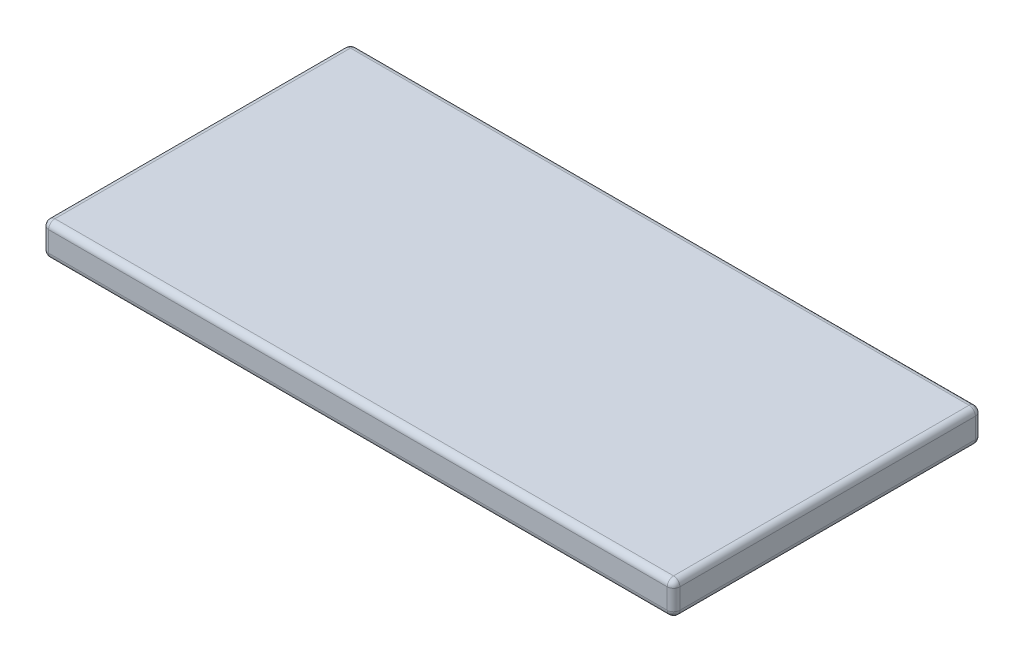
ISO-10303-21;
HEADER;
FILE_DESCRIPTION(('STEP AP214'),'2;1');
FILE_NAME('part.step','',(''),(''),'','','');
FILE_SCHEMA(('AUTOMOTIVE_DESIGN { 1 0 10303 214 1 1 1 1 }'));
ENDSEC;
DATA;
#1=APPLICATION_CONTEXT('core data for automotive mechanical design processes');
#2=APPLICATION_PROTOCOL_DEFINITION('international standard','automotive_design',2000,#1);
#3=PRODUCT_CONTEXT('',#1,'mechanical');
#4=PRODUCT('Part','Part','',(#3));
#5=PRODUCT_RELATED_PRODUCT_CATEGORY('part','',(#4));
#6=PRODUCT_DEFINITION_FORMATION('','',#4);
#7=PRODUCT_DEFINITION_CONTEXT('part definition',#1,'design');
#8=PRODUCT_DEFINITION('design','',#6,#7);
#9=PRODUCT_DEFINITION_SHAPE('','',#8);
#10=(LENGTH_UNIT() NAMED_UNIT(*) SI_UNIT(.MILLI.,.METRE.));
#11=(NAMED_UNIT(*) PLANE_ANGLE_UNIT() SI_UNIT($,.RADIAN.));
#12=(NAMED_UNIT(*) SI_UNIT($,.STERADIAN.) SOLID_ANGLE_UNIT());
#13=UNCERTAINTY_MEASURE_WITH_UNIT(LENGTH_MEASURE(1.E-05),#10,'distance_accuracy_value','');
#14=(GEOMETRIC_REPRESENTATION_CONTEXT(3) GLOBAL_UNCERTAINTY_ASSIGNED_CONTEXT((#13)) GLOBAL_UNIT_ASSIGNED_CONTEXT((#10,
#11,#12)) REPRESENTATION_CONTEXT('',''));
#15=CARTESIAN_POINT('',(0.,0.,0.));
#16=DIRECTION('',(0.,0.,1.));
#17=DIRECTION('',(1.,0.,0.));
#18=AXIS2_PLACEMENT_3D('',#15,#16,#17);
#19=CARTESIAN_POINT('',(-49.82,5.2,-24.32));
#20=DIRECTION('',(1.,0.,0.));
#21=DIRECTION('',(0.,0.,-1.));
#22=AXIS2_PLACEMENT_3D('',#19,#20,#21);
#23=PLANE('',#22);
#24=DIRECTION('',(0.,-1.,0.));
#25=VECTOR('',#24,1.);
#26=CARTESIAN_POINT('',(-49.82,5.2,-23.32));
#27=LINE('',#26,#25);
#28=CARTESIAN_POINT('',(-49.82,4.2,-23.32));
#29=VERTEX_POINT('',#28);
#30=CARTESIAN_POINT('',(-49.82,1.,-23.32));
#31=VERTEX_POINT('',#30);
#32=EDGE_CURVE('E170',#29,#31,#27,.T.);
#33=ORIENTED_EDGE('',*,*,#32,.T.);
#34=DIRECTION('',(0.,0.,1.));
#35=VECTOR('',#34,1.);
#36=CARTESIAN_POINT('',(-49.82,1.,-24.32));
#37=LINE('',#36,#35);
#38=CARTESIAN_POINT('',(-49.82,1.,23.32));
#39=VERTEX_POINT('',#38);
#40=EDGE_CURVE('E175',#31,#39,#37,.T.);
#41=ORIENTED_EDGE('',*,*,#40,.T.);
#42=DIRECTION('',(0.,-1.,0.));
#43=VECTOR('',#42,1.);
#44=CARTESIAN_POINT('',(-49.82,5.2,23.32));
#45=LINE('',#44,#43);
#46=CARTESIAN_POINT('',(-49.82,4.2,23.32));
#47=VERTEX_POINT('',#46);
#48=EDGE_CURVE('E172',#39,#47,#45,.F.);
#49=ORIENTED_EDGE('',*,*,#48,.T.);
#50=DIRECTION('',(0.,0.,1.));
#51=VECTOR('',#50,1.);
#52=CARTESIAN_POINT('',(-49.82,4.2,-24.32));
#53=LINE('',#52,#51);
#54=EDGE_CURVE('E168',#47,#29,#53,.F.);
#55=ORIENTED_EDGE('',*,*,#54,.T.);
#56=EDGE_LOOP('',(#33,#41,#49,#55));
#57=FACE_BOUND('',#56,.T.);
#58=ADVANCED_FACE('F35',(#57),#23,.F.);
#59=CARTESIAN_POINT('',(-49.82,5.2,24.32));
#60=DIRECTION('',(0.,0.,-1.));
#61=DIRECTION('',(-1.,0.,0.));
#62=AXIS2_PLACEMENT_3D('',#59,#60,#61);
#63=PLANE('',#62);
#64=DIRECTION('',(1.,0.,0.));
#65=VECTOR('',#64,1.);
#66=CARTESIAN_POINT('',(-49.82,4.2,24.32));
#67=LINE('',#66,#65);
#68=CARTESIAN_POINT('',(48.82,4.2,24.32));
#69=VERTEX_POINT('',#68);
#70=CARTESIAN_POINT('',(-48.82,4.2,24.32));
#71=VERTEX_POINT('',#70);
#72=EDGE_CURVE('E130',#69,#71,#67,.F.);
#73=ORIENTED_EDGE('',*,*,#72,.T.);
#74=DIRECTION('',(0.,-1.,0.));
#75=VECTOR('',#74,1.);
#76=CARTESIAN_POINT('',(-48.82,5.2,24.32));
#77=LINE('',#76,#75);
#78=CARTESIAN_POINT('',(-48.82,1.,24.32));
#79=VERTEX_POINT('',#78);
#80=EDGE_CURVE('E166',#71,#79,#77,.T.);
#81=ORIENTED_EDGE('',*,*,#80,.T.);
#82=DIRECTION('',(1.,0.,0.));
#83=VECTOR('',#82,1.);
#84=CARTESIAN_POINT('',(-49.82,1.,24.32));
#85=LINE('',#84,#83);
#86=CARTESIAN_POINT('',(48.82,1.,24.32));
#87=VERTEX_POINT('',#86);
#88=EDGE_CURVE('E133',#79,#87,#85,.T.);
#89=ORIENTED_EDGE('',*,*,#88,.T.);
#90=DIRECTION('',(0.,-1.,0.));
#91=VECTOR('',#90,1.);
#92=CARTESIAN_POINT('',(48.82,5.2,24.32));
#93=LINE('',#92,#91);
#94=EDGE_CURVE('E125',#87,#69,#93,.F.);
#95=ORIENTED_EDGE('',*,*,#94,.T.);
#96=EDGE_LOOP('',(#73,#81,#89,#95));
#97=FACE_BOUND('',#96,.T.);
#98=ADVANCED_FACE('F127',(#97),#63,.F.);
#99=CARTESIAN_POINT('',(49.82,5.2,-24.32));
#100=DIRECTION('',(-1.,0.,0.));
#101=DIRECTION('',(0.,0.,1.));
#102=AXIS2_PLACEMENT_3D('',#99,#100,#101);
#103=PLANE('',#102);
#104=DIRECTION('',(0.,0.,-1.));
#105=VECTOR('',#104,1.);
#106=CARTESIAN_POINT('',(49.82,1.,-24.32));
#107=LINE('',#106,#105);
#108=CARTESIAN_POINT('',(49.82,1.,23.32));
#109=VERTEX_POINT('',#108);
#110=CARTESIAN_POINT('',(49.82,1.,-23.32));
#111=VERTEX_POINT('',#110);
#112=EDGE_CURVE('E198',#109,#111,#107,.T.);
#113=ORIENTED_EDGE('',*,*,#112,.T.);
#114=DIRECTION('',(0.,-1.,0.));
#115=VECTOR('',#114,1.);
#116=CARTESIAN_POINT('',(49.82,5.2,-23.32));
#117=LINE('',#116,#115);
#118=CARTESIAN_POINT('',(49.82,4.2,-23.32));
#119=VERTEX_POINT('',#118);
#120=EDGE_CURVE('E200',#111,#119,#117,.F.);
#121=ORIENTED_EDGE('',*,*,#120,.T.);
#122=DIRECTION('',(0.,0.,-1.));
#123=VECTOR('',#122,1.);
#124=CARTESIAN_POINT('',(49.82,4.2,24.32));
#125=LINE('',#124,#123);
#126=CARTESIAN_POINT('',(49.82,4.2,23.32));
#127=VERTEX_POINT('',#126);
#128=EDGE_CURVE('E195',#119,#127,#125,.F.);
#129=ORIENTED_EDGE('',*,*,#128,.T.);
#130=DIRECTION('',(0.,-1.,0.));
#131=VECTOR('',#130,1.);
#132=CARTESIAN_POINT('',(49.82,5.2,23.32));
#133=LINE('',#132,#131);
#134=EDGE_CURVE('E143',#127,#109,#133,.T.);
#135=ORIENTED_EDGE('',*,*,#134,.T.);
#136=EDGE_LOOP('',(#113,#121,#129,#135));
#137=FACE_BOUND('',#136,.T.);
#138=ADVANCED_FACE('F334',(#137),#103,.F.);
#139=CARTESIAN_POINT('',(-49.82,5.2,-24.32));
#140=DIRECTION('',(0.,0.,1.));
#141=DIRECTION('',(1.,0.,0.));
#142=AXIS2_PLACEMENT_3D('',#139,#140,#141);
#143=PLANE('',#142);
#144=DIRECTION('',(-1.,0.,0.));
#145=VECTOR('',#144,1.);
#146=CARTESIAN_POINT('',(-49.82,1.,-24.32));
#147=LINE('',#146,#145);
#148=CARTESIAN_POINT('',(48.82,1.,-24.32));
#149=VERTEX_POINT('',#148);
#150=CARTESIAN_POINT('',(-48.82,1.,-24.32));
#151=VERTEX_POINT('',#150);
#152=EDGE_CURVE('E181',#149,#151,#147,.T.);
#153=ORIENTED_EDGE('',*,*,#152,.T.);
#154=DIRECTION('',(0.,-1.,0.));
#155=VECTOR('',#154,1.);
#156=CARTESIAN_POINT('',(-48.82,5.2,-24.32));
#157=LINE('',#156,#155);
#158=CARTESIAN_POINT('',(-48.82,4.2,-24.32));
#159=VERTEX_POINT('',#158);
#160=EDGE_CURVE('E183',#151,#159,#157,.F.);
#161=ORIENTED_EDGE('',*,*,#160,.T.);
#162=DIRECTION('',(-1.,0.,0.));
#163=VECTOR('',#162,1.);
#164=CARTESIAN_POINT('',(49.82,4.2,-24.32));
#165=LINE('',#164,#163);
#166=CARTESIAN_POINT('',(48.82,4.2,-24.32));
#167=VERTEX_POINT('',#166);
#168=EDGE_CURVE('E177',#159,#167,#165,.F.);
#169=ORIENTED_EDGE('',*,*,#168,.T.);
#170=DIRECTION('',(0.,-1.,0.));
#171=VECTOR('',#170,1.);
#172=CARTESIAN_POINT('',(48.82,5.2,-24.32));
#173=LINE('',#172,#171);
#174=EDGE_CURVE('E179',#167,#149,#173,.T.);
#175=ORIENTED_EDGE('',*,*,#174,.T.);
#176=EDGE_LOOP('',(#153,#161,#169,#175));
#177=FACE_BOUND('',#176,.T.);
#178=ADVANCED_FACE('F279',(#177),#143,.F.);
#179=CARTESIAN_POINT('',(0.,5.2,0.));
#180=DIRECTION('',(0.,1.,0.));
#181=DIRECTION('',(0.,0.,1.));
#182=AXIS2_PLACEMENT_3D('',#179,#180,#181);
#183=PLANE('',#182);
#184=DIRECTION('',(1.,0.,0.));
#185=VECTOR('',#184,1.);
#186=CARTESIAN_POINT('',(49.82,5.2,23.32));
#187=LINE('',#186,#185);
#188=CARTESIAN_POINT('',(-48.82,5.2,23.32));
#189=VERTEX_POINT('',#188);
#190=CARTESIAN_POINT('',(48.82,5.2,23.32));
#191=VERTEX_POINT('',#190);
#192=EDGE_CURVE('E44',#189,#191,#187,.T.);
#193=ORIENTED_EDGE('',*,*,#192,.T.);
#194=DIRECTION('',(0.,0.,-1.));
#195=VECTOR('',#194,1.);
#196=CARTESIAN_POINT('',(48.82,5.2,-24.32));
#197=LINE('',#196,#195);
#198=CARTESIAN_POINT('',(48.82,5.2,-23.32));
#199=VERTEX_POINT('',#198);
#200=EDGE_CURVE('E11',#191,#199,#197,.T.);
#201=ORIENTED_EDGE('',*,*,#200,.T.);
#202=DIRECTION('',(-1.,0.,0.));
#203=VECTOR('',#202,1.);
#204=CARTESIAN_POINT('',(-49.82,5.2,-23.32));
#205=LINE('',#204,#203);
#206=CARTESIAN_POINT('',(-48.82,5.2,-23.32));
#207=VERTEX_POINT('',#206);
#208=EDGE_CURVE('E58',#199,#207,#205,.T.);
#209=ORIENTED_EDGE('',*,*,#208,.T.);
#210=DIRECTION('',(0.,0.,1.));
#211=VECTOR('',#210,1.);
#212=CARTESIAN_POINT('',(-48.82,5.2,24.32));
#213=LINE('',#212,#211);
#214=EDGE_CURVE('E203',#207,#189,#213,.T.);
#215=ORIENTED_EDGE('',*,*,#214,.T.);
#216=EDGE_LOOP('',(#193,#201,#209,#215));
#217=FACE_BOUND('',#216,.T.);
#218=ADVANCED_FACE('F296',(#217),#183,.T.);
#219=CARTESIAN_POINT('',(0.,0.,0.));
#220=DIRECTION('',(0.,1.,0.));
#221=DIRECTION('',(0.,0.,1.));
#222=AXIS2_PLACEMENT_3D('',#219,#220,#221);
#223=PLANE('',#222);
#224=DIRECTION('',(1.,0.,0.));
#225=VECTOR('',#224,1.);
#226=CARTESIAN_POINT('',(0.,0.,23.32));
#227=LINE('',#226,#225);
#228=CARTESIAN_POINT('',(48.82,0.,23.32));
#229=VERTEX_POINT('',#228);
#230=CARTESIAN_POINT('',(-48.82,0.,23.32));
#231=VERTEX_POINT('',#230);
#232=EDGE_CURVE('E188',#229,#231,#227,.F.);
#233=ORIENTED_EDGE('',*,*,#232,.T.);
#234=DIRECTION('',(0.,0.,1.));
#235=VECTOR('',#234,1.);
#236=CARTESIAN_POINT('',(-48.82,0.,0.));
#237=LINE('',#236,#235);
#238=CARTESIAN_POINT('',(-48.82,0.,-23.32));
#239=VERTEX_POINT('',#238);
#240=EDGE_CURVE('E192',#231,#239,#237,.F.);
#241=ORIENTED_EDGE('',*,*,#240,.T.);
#242=DIRECTION('',(-1.,0.,0.));
#243=VECTOR('',#242,1.);
#244=CARTESIAN_POINT('',(0.,0.,-23.32));
#245=LINE('',#244,#243);
#246=CARTESIAN_POINT('',(48.82,0.,-23.32));
#247=VERTEX_POINT('',#246);
#248=EDGE_CURVE('E190',#239,#247,#245,.F.);
#249=ORIENTED_EDGE('',*,*,#248,.T.);
#250=DIRECTION('',(0.,0.,-1.));
#251=VECTOR('',#250,1.);
#252=CARTESIAN_POINT('',(48.82,0.,0.));
#253=LINE('',#252,#251);
#254=EDGE_CURVE('E186',#247,#229,#253,.F.);
#255=ORIENTED_EDGE('',*,*,#254,.T.);
#256=EDGE_LOOP('',(#233,#241,#249,#255));
#257=FACE_BOUND('',#256,.T.);
#258=ADVANCED_FACE('F270',(#257),#223,.F.);
#259=CARTESIAN_POINT('',(48.82,5.2,-23.32));
#260=DIRECTION('',(0.,-1.,0.));
#261=DIRECTION('',(0.,0.,-1.));
#262=AXIS2_PLACEMENT_3D('',#259,#260,#261);
#263=CYLINDRICAL_SURFACE('',#262,1.);
#264=CARTESIAN_POINT('',(48.82,4.2,-23.32));
#265=DIRECTION('',(0.,1.,0.));
#266=DIRECTION('',(0.,0.,1.));
#267=AXIS2_PLACEMENT_3D('',#264,#265,#266);
#268=CIRCLE('',#267,1.);
#269=EDGE_CURVE('E39',#119,#167,#268,.T.);
#270=ORIENTED_EDGE('',*,*,#269,.F.);
#271=ORIENTED_EDGE('',*,*,#120,.F.);
#272=CARTESIAN_POINT('',(48.82,1.,-23.32));
#273=DIRECTION('',(0.,-1.,0.));
#274=DIRECTION('',(0.,0.,-1.));
#275=AXIS2_PLACEMENT_3D('',#272,#273,#274);
#276=CIRCLE('',#275,1.);
#277=EDGE_CURVE('E163',#149,#111,#276,.T.);
#278=ORIENTED_EDGE('',*,*,#277,.F.);
#279=ORIENTED_EDGE('',*,*,#174,.F.);
#280=EDGE_LOOP('',(#270,#271,#278,#279));
#281=FACE_BOUND('',#280,.T.);
#282=ADVANCED_FACE('F37',(#281),#263,.T.);
#283=CARTESIAN_POINT('',(48.82,4.2,-23.32));
#284=DIRECTION('',(0.,0.,1.));
#285=DIRECTION('',(1.,0.,0.));
#286=AXIS2_PLACEMENT_3D('',#283,#284,#285);
#287=SPHERICAL_SURFACE('',#286,1.);
#288=CARTESIAN_POINT('',(48.82,4.2,-23.32));
#289=DIRECTION('',(0.,0.,-1.));
#290=DIRECTION('',(-1.,0.,0.));
#291=AXIS2_PLACEMENT_3D('',#288,#289,#290);
#292=CIRCLE('',#291,1.);
#293=EDGE_CURVE('E249',#119,#199,#292,.F.);
#294=ORIENTED_EDGE('',*,*,#293,.F.);
#295=ORIENTED_EDGE('',*,*,#269,.T.);
#296=CARTESIAN_POINT('',(48.82,4.2,-23.32));
#297=DIRECTION('',(1.,0.,0.));
#298=DIRECTION('',(0.,0.,-1.));
#299=AXIS2_PLACEMENT_3D('',#296,#297,#298);
#300=CIRCLE('',#299,1.);
#301=EDGE_CURVE('E252',#199,#167,#300,.F.);
#302=ORIENTED_EDGE('',*,*,#301,.F.);
#303=EDGE_LOOP('',(#294,#295,#302));
#304=FACE_BOUND('',#303,.T.);
#305=ADVANCED_FACE('F293',(#304),#287,.T.);
#306=CARTESIAN_POINT('',(48.82,1.,-23.32));
#307=DIRECTION('',(0.,0.,1.));
#308=DIRECTION('',(1.,0.,0.));
#309=AXIS2_PLACEMENT_3D('',#306,#307,#308);
#310=SPHERICAL_SURFACE('',#309,1.);
#311=CARTESIAN_POINT('',(48.82,1.,-23.32));
#312=DIRECTION('',(1.,0.,0.));
#313=DIRECTION('',(0.,0.,-1.));
#314=AXIS2_PLACEMENT_3D('',#311,#312,#313);
#315=CIRCLE('',#314,1.);
#316=EDGE_CURVE('E243',#149,#247,#315,.F.);
#317=ORIENTED_EDGE('',*,*,#316,.F.);
#318=ORIENTED_EDGE('',*,*,#277,.T.);
#319=CARTESIAN_POINT('',(48.82,1.,-23.32));
#320=DIRECTION('',(0.,0.,-1.));
#321=DIRECTION('',(-1.,0.,0.));
#322=AXIS2_PLACEMENT_3D('',#319,#320,#321);
#323=CIRCLE('',#322,1.);
#324=EDGE_CURVE('E246',#247,#111,#323,.F.);
#325=ORIENTED_EDGE('',*,*,#324,.F.);
#326=EDGE_LOOP('',(#317,#318,#325));
#327=FACE_BOUND('',#326,.T.);
#328=ADVANCED_FACE('F258',(#327),#310,.T.);
#329=CARTESIAN_POINT('',(0.,4.2,-23.32));
#330=DIRECTION('',(1.,0.,0.));
#331=DIRECTION('',(0.,0.,-1.));
#332=AXIS2_PLACEMENT_3D('',#329,#330,#331);
#333=CYLINDRICAL_SURFACE('',#332,1.);
#334=ORIENTED_EDGE('',*,*,#301,.T.);
#335=ORIENTED_EDGE('',*,*,#168,.F.);
#336=CARTESIAN_POINT('',(-48.82,4.2,-23.32));
#337=DIRECTION('',(-1.,0.,0.));
#338=DIRECTION('',(0.,0.,1.));
#339=AXIS2_PLACEMENT_3D('',#336,#337,#338);
#340=CIRCLE('',#339,1.);
#341=EDGE_CURVE('E238',#207,#159,#340,.T.);
#342=ORIENTED_EDGE('',*,*,#341,.F.);
#343=ORIENTED_EDGE('',*,*,#208,.F.);
#344=EDGE_LOOP('',(#334,#335,#342,#343));
#345=FACE_BOUND('',#344,.T.);
#346=ADVANCED_FACE('F289',(#345),#333,.T.);
#347=CARTESIAN_POINT('',(48.82,4.2,0.));
#348=DIRECTION('',(0.,0.,1.));
#349=DIRECTION('',(1.,0.,0.));
#350=AXIS2_PLACEMENT_3D('',#347,#348,#349);
#351=CYLINDRICAL_SURFACE('',#350,1.);
#352=ORIENTED_EDGE('',*,*,#293,.T.);
#353=ORIENTED_EDGE('',*,*,#200,.F.);
#354=CARTESIAN_POINT('',(48.82,4.2,23.32));
#355=DIRECTION('',(0.,0.,1.));
#356=DIRECTION('',(1.,0.,0.));
#357=AXIS2_PLACEMENT_3D('',#354,#355,#356);
#358=CIRCLE('',#357,1.);
#359=EDGE_CURVE('E147',#127,#191,#358,.T.);
#360=ORIENTED_EDGE('',*,*,#359,.F.);
#361=ORIENTED_EDGE('',*,*,#128,.F.);
#362=EDGE_LOOP('',(#352,#353,#360,#361));
#363=FACE_BOUND('',#362,.T.);
#364=ADVANCED_FACE('F295',(#363),#351,.T.);
#365=CARTESIAN_POINT('',(48.82,5.2,23.32));
#366=DIRECTION('',(0.,-1.,0.));
#367=DIRECTION('',(0.,0.,-1.));
#368=AXIS2_PLACEMENT_3D('',#365,#366,#367);
#369=CYLINDRICAL_SURFACE('',#368,1.);
#370=CARTESIAN_POINT('',(48.82,1.,23.32));
#371=DIRECTION('',(0.,-1.,0.));
#372=DIRECTION('',(0.,0.,-1.));
#373=AXIS2_PLACEMENT_3D('',#370,#371,#372);
#374=CIRCLE('',#373,1.);
#375=EDGE_CURVE('E148',#109,#87,#374,.T.);
#376=ORIENTED_EDGE('',*,*,#375,.F.);
#377=ORIENTED_EDGE('',*,*,#134,.F.);
#378=CARTESIAN_POINT('',(48.82,4.2,23.32));
#379=DIRECTION('',(0.,1.,0.));
#380=DIRECTION('',(0.,0.,1.));
#381=AXIS2_PLACEMENT_3D('',#378,#379,#380);
#382=CIRCLE('',#381,1.);
#383=EDGE_CURVE('E140',#69,#127,#382,.T.);
#384=ORIENTED_EDGE('',*,*,#383,.F.);
#385=ORIENTED_EDGE('',*,*,#94,.F.);
#386=EDGE_LOOP('',(#376,#377,#384,#385));
#387=FACE_BOUND('',#386,.T.);
#388=ADVANCED_FACE('F142',(#387),#369,.T.);
#389=CARTESIAN_POINT('',(48.82,1.,-24.32));
#390=DIRECTION('',(0.,0.,-1.));
#391=DIRECTION('',(-1.,0.,0.));
#392=AXIS2_PLACEMENT_3D('',#389,#390,#391);
#393=CYLINDRICAL_SURFACE('',#392,1.);
#394=ORIENTED_EDGE('',*,*,#324,.T.);
#395=ORIENTED_EDGE('',*,*,#112,.F.);
#396=CARTESIAN_POINT('',(48.82,1.,23.32));
#397=DIRECTION('',(0.,0.,1.));
#398=DIRECTION('',(1.,0.,0.));
#399=AXIS2_PLACEMENT_3D('',#396,#397,#398);
#400=CIRCLE('',#399,1.);
#401=EDGE_CURVE('E233',#229,#109,#400,.T.);
#402=ORIENTED_EDGE('',*,*,#401,.F.);
#403=ORIENTED_EDGE('',*,*,#254,.F.);
#404=EDGE_LOOP('',(#394,#395,#402,#403));
#405=FACE_BOUND('',#404,.T.);
#406=ADVANCED_FACE('F266',(#405),#393,.T.);
#407=CARTESIAN_POINT('',(-49.82,1.,-23.32));
#408=DIRECTION('',(-1.,0.,0.));
#409=DIRECTION('',(0.,0.,1.));
#410=AXIS2_PLACEMENT_3D('',#407,#408,#409);
#411=CYLINDRICAL_SURFACE('',#410,1.);
#412=ORIENTED_EDGE('',*,*,#316,.T.);
#413=ORIENTED_EDGE('',*,*,#248,.F.);
#414=CARTESIAN_POINT('',(-48.82,1.,-23.32));
#415=DIRECTION('',(-1.,0.,0.));
#416=DIRECTION('',(0.,0.,1.));
#417=AXIS2_PLACEMENT_3D('',#414,#415,#416);
#418=CIRCLE('',#417,1.);
#419=EDGE_CURVE('E230',#151,#239,#418,.T.);
#420=ORIENTED_EDGE('',*,*,#419,.F.);
#421=ORIENTED_EDGE('',*,*,#152,.F.);
#422=EDGE_LOOP('',(#412,#413,#420,#421));
#423=FACE_BOUND('',#422,.T.);
#424=ADVANCED_FACE('F276',(#423),#411,.T.);
#425=CARTESIAN_POINT('',(-48.82,5.2,-23.32));
#426=DIRECTION('',(0.,-1.,0.));
#427=DIRECTION('',(0.,0.,-1.));
#428=AXIS2_PLACEMENT_3D('',#425,#426,#427);
#429=CYLINDRICAL_SURFACE('',#428,1.);
#430=CARTESIAN_POINT('',(-48.82,4.2,-23.32));
#431=DIRECTION('',(0.,1.,0.));
#432=DIRECTION('',(0.,0.,1.));
#433=AXIS2_PLACEMENT_3D('',#430,#431,#432);
#434=CIRCLE('',#433,1.);
#435=EDGE_CURVE('E240',#159,#29,#434,.T.);
#436=ORIENTED_EDGE('',*,*,#435,.F.);
#437=ORIENTED_EDGE('',*,*,#160,.F.);
#438=CARTESIAN_POINT('',(-48.82,1.,-23.32));
#439=DIRECTION('',(0.,-1.,0.));
#440=DIRECTION('',(0.,0.,-1.));
#441=AXIS2_PLACEMENT_3D('',#438,#439,#440);
#442=CIRCLE('',#441,1.);
#443=EDGE_CURVE('E227',#31,#151,#442,.T.);
#444=ORIENTED_EDGE('',*,*,#443,.F.);
#445=ORIENTED_EDGE('',*,*,#32,.F.);
#446=EDGE_LOOP('',(#436,#437,#444,#445));
#447=FACE_BOUND('',#446,.T.);
#448=ADVANCED_FACE('F283',(#447),#429,.T.);
#449=CARTESIAN_POINT('',(-48.82,4.2,-23.32));
#450=DIRECTION('',(0.,0.,1.));
#451=DIRECTION('',(1.,0.,0.));
#452=AXIS2_PLACEMENT_3D('',#449,#450,#451);
#453=SPHERICAL_SURFACE('',#452,1.);
#454=ORIENTED_EDGE('',*,*,#341,.T.);
#455=ORIENTED_EDGE('',*,*,#435,.T.);
#456=CARTESIAN_POINT('',(-48.82,4.2,-23.32));
#457=DIRECTION('',(0.,0.,-1.));
#458=DIRECTION('',(-1.,0.,0.));
#459=AXIS2_PLACEMENT_3D('',#456,#457,#458);
#460=CIRCLE('',#459,1.);
#461=EDGE_CURVE('E154',#207,#29,#460,.F.);
#462=ORIENTED_EDGE('',*,*,#461,.F.);
#463=EDGE_LOOP('',(#454,#455,#462));
#464=FACE_BOUND('',#463,.T.);
#465=ADVANCED_FACE('F326',(#464),#453,.T.);
#466=CARTESIAN_POINT('',(48.82,4.2,23.32));
#467=DIRECTION('',(0.,0.,1.));
#468=DIRECTION('',(1.,0.,0.));
#469=AXIS2_PLACEMENT_3D('',#466,#467,#468);
#470=SPHERICAL_SURFACE('',#469,1.);
#471=ORIENTED_EDGE('',*,*,#383,.T.);
#472=ORIENTED_EDGE('',*,*,#359,.T.);
#473=CARTESIAN_POINT('',(48.82,4.2,23.32));
#474=DIRECTION('',(1.,0.,0.));
#475=DIRECTION('',(0.,0.,-1.));
#476=AXIS2_PLACEMENT_3D('',#473,#474,#475);
#477=CIRCLE('',#476,1.);
#478=EDGE_CURVE('E151',#69,#191,#477,.F.);
#479=ORIENTED_EDGE('',*,*,#478,.F.);
#480=EDGE_LOOP('',(#471,#472,#479));
#481=FACE_BOUND('',#480,.T.);
#482=ADVANCED_FACE('F152',(#481),#470,.T.);
#483=CARTESIAN_POINT('',(48.82,1.,23.32));
#484=DIRECTION('',(0.,0.,1.));
#485=DIRECTION('',(1.,0.,0.));
#486=AXIS2_PLACEMENT_3D('',#483,#484,#485);
#487=SPHERICAL_SURFACE('',#486,1.);
#488=ORIENTED_EDGE('',*,*,#401,.T.);
#489=ORIENTED_EDGE('',*,*,#375,.T.);
#490=CARTESIAN_POINT('',(48.82,1.,23.32));
#491=DIRECTION('',(1.,0.,0.));
#492=DIRECTION('',(0.,0.,-1.));
#493=AXIS2_PLACEMENT_3D('',#490,#491,#492);
#494=CIRCLE('',#493,1.);
#495=EDGE_CURVE('E155',#229,#87,#494,.F.);
#496=ORIENTED_EDGE('',*,*,#495,.F.);
#497=EDGE_LOOP('',(#488,#489,#496));
#498=FACE_BOUND('',#497,.T.);
#499=ADVANCED_FACE('F316',(#498),#487,.T.);
#500=CARTESIAN_POINT('',(-48.82,1.,-23.32));
#501=DIRECTION('',(0.,0.,1.));
#502=DIRECTION('',(1.,0.,0.));
#503=AXIS2_PLACEMENT_3D('',#500,#501,#502);
#504=SPHERICAL_SURFACE('',#503,1.);
#505=ORIENTED_EDGE('',*,*,#443,.T.);
#506=ORIENTED_EDGE('',*,*,#419,.T.);
#507=CARTESIAN_POINT('',(-48.82,1.,-23.32));
#508=DIRECTION('',(0.,0.,-1.));
#509=DIRECTION('',(-1.,0.,0.));
#510=AXIS2_PLACEMENT_3D('',#507,#508,#509);
#511=CIRCLE('',#510,1.);
#512=EDGE_CURVE('E221',#31,#239,#511,.F.);
#513=ORIENTED_EDGE('',*,*,#512,.F.);
#514=EDGE_LOOP('',(#505,#506,#513));
#515=FACE_BOUND('',#514,.T.);
#516=ADVANCED_FACE('F318',(#515),#504,.T.);
#517=CARTESIAN_POINT('',(-48.82,4.2,0.));
#518=DIRECTION('',(0.,0.,-1.));
#519=DIRECTION('',(-1.,0.,0.));
#520=AXIS2_PLACEMENT_3D('',#517,#518,#519);
#521=CYLINDRICAL_SURFACE('',#520,1.);
#522=ORIENTED_EDGE('',*,*,#461,.T.);
#523=ORIENTED_EDGE('',*,*,#54,.F.);
#524=CARTESIAN_POINT('',(-48.82,4.2,23.32));
#525=DIRECTION('',(0.,0.,1.));
#526=DIRECTION('',(1.,0.,0.));
#527=AXIS2_PLACEMENT_3D('',#524,#525,#526);
#528=CIRCLE('',#527,1.);
#529=EDGE_CURVE('E218',#189,#47,#528,.T.);
#530=ORIENTED_EDGE('',*,*,#529,.F.);
#531=ORIENTED_EDGE('',*,*,#214,.F.);
#532=EDGE_LOOP('',(#522,#523,#530,#531));
#533=FACE_BOUND('',#532,.T.);
#534=ADVANCED_FACE('F301',(#533),#521,.T.);
#535=CARTESIAN_POINT('',(0.,4.2,23.32));
#536=DIRECTION('',(-1.,0.,0.));
#537=DIRECTION('',(0.,0.,1.));
#538=AXIS2_PLACEMENT_3D('',#535,#536,#537);
#539=CYLINDRICAL_SURFACE('',#538,1.);
#540=ORIENTED_EDGE('',*,*,#478,.T.);
#541=ORIENTED_EDGE('',*,*,#192,.F.);
#542=CARTESIAN_POINT('',(-48.82,4.2,23.32));
#543=DIRECTION('',(-1.,0.,0.));
#544=DIRECTION('',(0.,0.,1.));
#545=AXIS2_PLACEMENT_3D('',#542,#543,#544);
#546=CIRCLE('',#545,1.);
#547=EDGE_CURVE('E159',#71,#189,#546,.T.);
#548=ORIENTED_EDGE('',*,*,#547,.F.);
#549=ORIENTED_EDGE('',*,*,#72,.F.);
#550=EDGE_LOOP('',(#540,#541,#548,#549));
#551=FACE_BOUND('',#550,.T.);
#552=ADVANCED_FACE('F157',(#551),#539,.T.);
#553=CARTESIAN_POINT('',(-49.82,1.,23.32));
#554=DIRECTION('',(1.,0.,0.));
#555=DIRECTION('',(0.,0.,-1.));
#556=AXIS2_PLACEMENT_3D('',#553,#554,#555);
#557=CYLINDRICAL_SURFACE('',#556,1.);
#558=ORIENTED_EDGE('',*,*,#495,.T.);
#559=ORIENTED_EDGE('',*,*,#88,.F.);
#560=CARTESIAN_POINT('',(-48.82,1.,23.32));
#561=DIRECTION('',(-1.,0.,0.));
#562=DIRECTION('',(0.,0.,1.));
#563=AXIS2_PLACEMENT_3D('',#560,#561,#562);
#564=CIRCLE('',#563,1.);
#565=EDGE_CURVE('E214',#231,#79,#564,.T.);
#566=ORIENTED_EDGE('',*,*,#565,.F.);
#567=ORIENTED_EDGE('',*,*,#232,.F.);
#568=EDGE_LOOP('',(#558,#559,#566,#567));
#569=FACE_BOUND('',#568,.T.);
#570=ADVANCED_FACE('F314',(#569),#557,.T.);
#571=CARTESIAN_POINT('',(-48.82,1.,-24.32));
#572=DIRECTION('',(0.,0.,1.));
#573=DIRECTION('',(1.,0.,0.));
#574=AXIS2_PLACEMENT_3D('',#571,#572,#573);
#575=CYLINDRICAL_SURFACE('',#574,1.);
#576=ORIENTED_EDGE('',*,*,#512,.T.);
#577=ORIENTED_EDGE('',*,*,#240,.F.);
#578=CARTESIAN_POINT('',(-48.82,1.,23.32));
#579=DIRECTION('',(0.,0.,1.));
#580=DIRECTION('',(1.,0.,0.));
#581=AXIS2_PLACEMENT_3D('',#578,#579,#580);
#582=CIRCLE('',#581,1.);
#583=EDGE_CURVE('E211',#39,#231,#582,.T.);
#584=ORIENTED_EDGE('',*,*,#583,.F.);
#585=ORIENTED_EDGE('',*,*,#40,.F.);
#586=EDGE_LOOP('',(#576,#577,#584,#585));
#587=FACE_BOUND('',#586,.T.);
#588=ADVANCED_FACE('F344',(#587),#575,.T.);
#589=CARTESIAN_POINT('',(-48.82,4.2,23.32));
#590=DIRECTION('',(0.,0.,1.));
#591=DIRECTION('',(1.,0.,0.));
#592=AXIS2_PLACEMENT_3D('',#589,#590,#591);
#593=SPHERICAL_SURFACE('',#592,1.);
#594=ORIENTED_EDGE('',*,*,#547,.T.);
#595=ORIENTED_EDGE('',*,*,#529,.T.);
#596=CARTESIAN_POINT('',(-48.82,4.2,23.32));
#597=DIRECTION('',(0.,1.,0.));
#598=DIRECTION('',(0.,0.,1.));
#599=AXIS2_PLACEMENT_3D('',#596,#597,#598);
#600=CIRCLE('',#599,1.);
#601=EDGE_CURVE('E209',#71,#47,#600,.F.);
#602=ORIENTED_EDGE('',*,*,#601,.F.);
#603=EDGE_LOOP('',(#594,#595,#602));
#604=FACE_BOUND('',#603,.T.);
#605=ADVANCED_FACE('F303',(#604),#593,.T.);
#606=CARTESIAN_POINT('',(-48.82,1.,23.32));
#607=DIRECTION('',(0.,0.,1.));
#608=DIRECTION('',(1.,0.,0.));
#609=AXIS2_PLACEMENT_3D('',#606,#607,#608);
#610=SPHERICAL_SURFACE('',#609,1.);
#611=ORIENTED_EDGE('',*,*,#583,.T.);
#612=ORIENTED_EDGE('',*,*,#565,.T.);
#613=CARTESIAN_POINT('',(-48.82,1.,23.32));
#614=DIRECTION('',(0.,-1.,0.));
#615=DIRECTION('',(0.,0.,-1.));
#616=AXIS2_PLACEMENT_3D('',#613,#614,#615);
#617=CIRCLE('',#616,1.);
#618=EDGE_CURVE('E207',#39,#79,#617,.F.);
#619=ORIENTED_EDGE('',*,*,#618,.F.);
#620=EDGE_LOOP('',(#611,#612,#619));
#621=FACE_BOUND('',#620,.T.);
#622=ADVANCED_FACE('F311',(#621),#610,.T.);
#623=CARTESIAN_POINT('',(-48.82,5.2,23.32));
#624=DIRECTION('',(0.,-1.,0.));
#625=DIRECTION('',(0.,0.,-1.));
#626=AXIS2_PLACEMENT_3D('',#623,#624,#625);
#627=CYLINDRICAL_SURFACE('',#626,1.);
#628=ORIENTED_EDGE('',*,*,#601,.T.);
#629=ORIENTED_EDGE('',*,*,#48,.F.);
#630=ORIENTED_EDGE('',*,*,#618,.T.);
#631=ORIENTED_EDGE('',*,*,#80,.F.);
#632=EDGE_LOOP('',(#628,#629,#630,#631));
#633=FACE_BOUND('',#632,.T.);
#634=ADVANCED_FACE('F307',(#633),#627,.T.);
#635=CLOSED_SHELL('',(#58,#98,#138,#178,#218,#258,#282,#305,#328,#346,#364,#388,#406,#424,#448,
#465,#482,#499,#516,#534,#552,#570,#588,#605,#622,#634));
#636=MANIFOLD_SOLID_BREP('B2',#635);
#637=ADVANCED_BREP_SHAPE_REPRESENTATION('',(#18,#636),#14);
#638=SHAPE_DEFINITION_REPRESENTATION(#9,#637);
ENDSEC;
END-ISO-10303-21;
